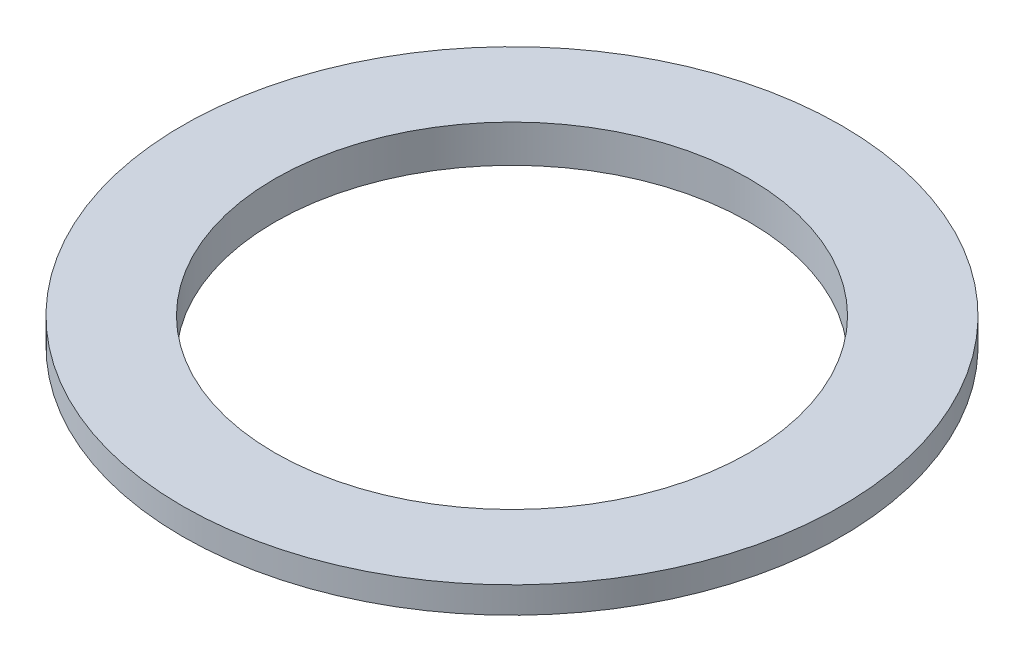
ISO-10303-21;
HEADER;
FILE_DESCRIPTION(('STEP AP214'),'2;1');
FILE_NAME('part.step','',(''),(''),'','','');
FILE_SCHEMA(('AUTOMOTIVE_DESIGN { 1 0 10303 214 1 1 1 1 }'));
ENDSEC;
DATA;
#1=APPLICATION_CONTEXT('core data for automotive mechanical design processes');
#2=APPLICATION_PROTOCOL_DEFINITION('international standard','automotive_design',2000,#1);
#3=PRODUCT_CONTEXT('',#1,'mechanical');
#4=PRODUCT('Part','Part','',(#3));
#5=PRODUCT_RELATED_PRODUCT_CATEGORY('part','',(#4));
#6=PRODUCT_DEFINITION_FORMATION('','',#4);
#7=PRODUCT_DEFINITION_CONTEXT('part definition',#1,'design');
#8=PRODUCT_DEFINITION('design','',#6,#7);
#9=PRODUCT_DEFINITION_SHAPE('','',#8);
#10=(LENGTH_UNIT() NAMED_UNIT(*) SI_UNIT(.MILLI.,.METRE.));
#11=(NAMED_UNIT(*) PLANE_ANGLE_UNIT() SI_UNIT($,.RADIAN.));
#12=(NAMED_UNIT(*) SI_UNIT($,.STERADIAN.) SOLID_ANGLE_UNIT());
#13=UNCERTAINTY_MEASURE_WITH_UNIT(LENGTH_MEASURE(1.E-05),#10,'distance_accuracy_value','');
#14=(GEOMETRIC_REPRESENTATION_CONTEXT(3) GLOBAL_UNCERTAINTY_ASSIGNED_CONTEXT((#13)) GLOBAL_UNIT_ASSIGNED_CONTEXT((#10,
#11,#12)) REPRESENTATION_CONTEXT('',''));
#15=CARTESIAN_POINT('',(0.,0.,0.));
#16=DIRECTION('',(0.,0.,1.));
#17=DIRECTION('',(1.,0.,0.));
#18=AXIS2_PLACEMENT_3D('',#15,#16,#17);
#19=CARTESIAN_POINT('',(0.,0.,0.));
#20=DIRECTION('',(0.,1.,0.));
#21=DIRECTION('',(0.,0.,1.));
#22=AXIS2_PLACEMENT_3D('',#19,#20,#21);
#23=PLANE('',#22);
#24=CARTESIAN_POINT('',(0.,0.,0.));
#25=DIRECTION('',(0.,1.,0.));
#26=DIRECTION('',(0.,0.,1.));
#27=AXIS2_PLACEMENT_3D('',#24,#25,#26);
#28=CIRCLE('',#27,138.05066916);
#29=CARTESIAN_POINT('',(0.,0.,138.05066916));
#30=VERTEX_POINT('',#29);
#31=EDGE_CURVE('E35',#30,#30,#28,.T.);
#32=ORIENTED_EDGE('',*,*,#31,.F.);
#33=EDGE_LOOP('',(#32));
#34=FACE_BOUND('',#33,.T.);
#35=CARTESIAN_POINT('',(0.,0.,0.));
#36=DIRECTION('',(0.,1.,0.));
#37=DIRECTION('',(0.,0.,1.));
#38=AXIS2_PLACEMENT_3D('',#35,#36,#37);
#39=CIRCLE('',#38,114.3);
#40=CARTESIAN_POINT('',(0.,0.,114.3));
#41=VERTEX_POINT('',#40);
#42=EDGE_CURVE('E42',#41,#41,#39,.T.);
#43=ORIENTED_EDGE('',*,*,#42,.T.);
#44=EDGE_LOOP('',(#43));
#45=FACE_BOUND('',#44,.T.);
#46=ADVANCED_FACE('F31',(#34,#45),#23,.F.);
#47=CARTESIAN_POINT('',(0.,5.349999936,0.));
#48=DIRECTION('',(0.,-1.,0.));
#49=DIRECTION('',(0.,0.,-1.));
#50=AXIS2_PLACEMENT_3D('',#47,#48,#49);
#51=CYLINDRICAL_SURFACE('',#50,138.05066916);
#52=CARTESIAN_POINT('',(0.,5.349999936,0.));
#53=DIRECTION('',(0.,1.,0.));
#54=DIRECTION('',(0.,0.,1.));
#55=AXIS2_PLACEMENT_3D('',#52,#53,#54);
#56=CIRCLE('',#55,138.05066916);
#57=CARTESIAN_POINT('',(0.,5.349999936,138.05066916));
#58=VERTEX_POINT('',#57);
#59=EDGE_CURVE('E10',#58,#58,#56,.T.);
#60=ORIENTED_EDGE('',*,*,#59,.F.);
#61=EDGE_LOOP('',(#60));
#62=FACE_BOUND('',#61,.T.);
#63=ORIENTED_EDGE('',*,*,#31,.T.);
#64=EDGE_LOOP('',(#63));
#65=FACE_BOUND('',#64,.T.);
#66=ADVANCED_FACE('F33',(#62,#65),#51,.T.);
#67=CARTESIAN_POINT('',(0.,5.349999936,0.));
#68=DIRECTION('',(0.,-1.,0.));
#69=DIRECTION('',(0.,0.,-1.));
#70=AXIS2_PLACEMENT_3D('',#67,#68,#69);
#71=CYLINDRICAL_SURFACE('',#70,114.3);
#72=ORIENTED_EDGE('',*,*,#42,.F.);
#73=EDGE_LOOP('',(#72));
#74=FACE_BOUND('',#73,.T.);
#75=CARTESIAN_POINT('',(0.,18.049999936,0.));
#76=DIRECTION('',(0.,1.,0.));
#77=DIRECTION('',(0.,0.,1.));
#78=AXIS2_PLACEMENT_3D('',#75,#76,#77);
#79=CIRCLE('',#78,114.3);
#80=CARTESIAN_POINT('',(0.,18.049999936,114.3));
#81=VERTEX_POINT('',#80);
#82=EDGE_CURVE('E50',#81,#81,#79,.T.);
#83=ORIENTED_EDGE('',*,*,#82,.T.);
#84=EDGE_LOOP('',(#83));
#85=FACE_BOUND('',#84,.T.);
#86=ADVANCED_FACE('F56',(#74,#85),#71,.F.);
#87=CARTESIAN_POINT('',(0.,18.049999936,0.));
#88=DIRECTION('',(0.,1.,0.));
#89=DIRECTION('',(0.,0.,1.));
#90=AXIS2_PLACEMENT_3D('',#87,#88,#89);
#91=PLANE('',#90);
#92=CARTESIAN_POINT('',(0.,18.049999936,0.));
#93=DIRECTION('',(0.,1.,0.));
#94=DIRECTION('',(0.,0.,1.));
#95=AXIS2_PLACEMENT_3D('',#92,#93,#94);
#96=CIRCLE('',#95,158.75);
#97=CARTESIAN_POINT('',(0.,18.049999936,158.75));
#98=VERTEX_POINT('',#97);
#99=EDGE_CURVE('E46',#98,#98,#96,.T.);
#100=ORIENTED_EDGE('',*,*,#99,.T.);
#101=EDGE_LOOP('',(#100));
#102=FACE_BOUND('',#101,.T.);
#103=ORIENTED_EDGE('',*,*,#82,.F.);
#104=EDGE_LOOP('',(#103));
#105=FACE_BOUND('',#104,.T.);
#106=ADVANCED_FACE('F58',(#102,#105),#91,.T.);
#107=CARTESIAN_POINT('',(0.,5.349999936,0.));
#108=DIRECTION('',(0.,1.,0.));
#109=DIRECTION('',(0.,0.,1.));
#110=AXIS2_PLACEMENT_3D('',#107,#108,#109);
#111=PLANE('',#110);
#112=ORIENTED_EDGE('',*,*,#59,.T.);
#113=EDGE_LOOP('',(#112));
#114=FACE_BOUND('',#113,.T.);
#115=CARTESIAN_POINT('',(0.,5.349999936,0.));
#116=DIRECTION('',(0.,1.,0.));
#117=DIRECTION('',(0.,0.,1.));
#118=AXIS2_PLACEMENT_3D('',#115,#116,#117);
#119=CIRCLE('',#118,158.75);
#120=CARTESIAN_POINT('',(0.,5.349999936,158.75));
#121=VERTEX_POINT('',#120);
#122=EDGE_CURVE('E47',#121,#121,#119,.T.);
#123=ORIENTED_EDGE('',*,*,#122,.F.);
#124=EDGE_LOOP('',(#123));
#125=FACE_BOUND('',#124,.T.);
#126=ADVANCED_FACE('F60',(#114,#125),#111,.F.);
#127=CARTESIAN_POINT('',(0.,18.049999936,0.));
#128=DIRECTION('',(0.,-1.,0.));
#129=DIRECTION('',(0.,0.,-1.));
#130=AXIS2_PLACEMENT_3D('',#127,#128,#129);
#131=CYLINDRICAL_SURFACE('',#130,158.75);
#132=ORIENTED_EDGE('',*,*,#99,.F.);
#133=EDGE_LOOP('',(#132));
#134=FACE_BOUND('',#133,.T.);
#135=ORIENTED_EDGE('',*,*,#122,.T.);
#136=EDGE_LOOP('',(#135));
#137=FACE_BOUND('',#136,.T.);
#138=ADVANCED_FACE('F67',(#134,#137),#131,.T.);
#139=CLOSED_SHELL('',(#46,#66,#86,#106,#126,#138));
#140=MANIFOLD_SOLID_BREP('B2',#139);
#141=ADVANCED_BREP_SHAPE_REPRESENTATION('',(#18,#140),#14);
#142=SHAPE_DEFINITION_REPRESENTATION(#9,#141);
ENDSEC;
END-ISO-10303-21;
